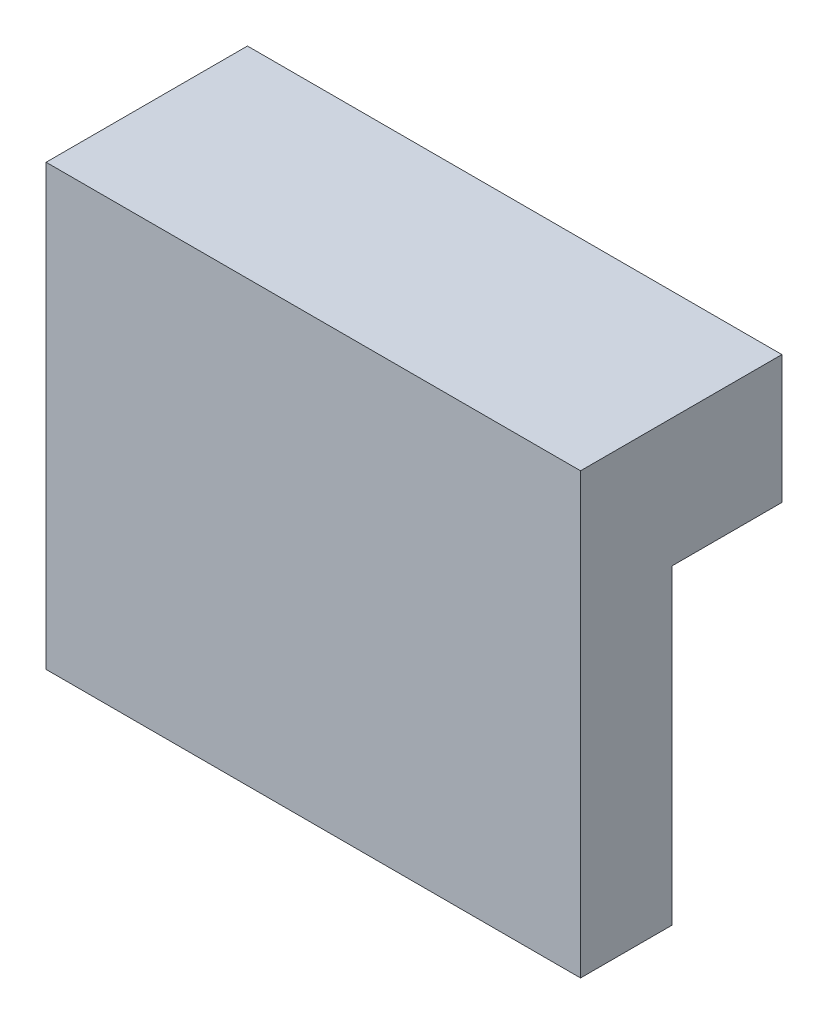
ISO-10303-21;
HEADER;
FILE_DESCRIPTION(('STEP AP214'),'2;1');
FILE_NAME('part.step','',(''),(''),'','','');
FILE_SCHEMA(('AUTOMOTIVE_DESIGN { 1 0 10303 214 1 1 1 1 }'));
ENDSEC;
DATA;
#1=APPLICATION_CONTEXT('core data for automotive mechanical design processes');
#2=APPLICATION_PROTOCOL_DEFINITION('international standard','automotive_design',2000,#1);
#3=PRODUCT_CONTEXT('',#1,'mechanical');
#4=PRODUCT('Part','Part','',(#3));
#5=PRODUCT_RELATED_PRODUCT_CATEGORY('part','',(#4));
#6=PRODUCT_DEFINITION_FORMATION('','',#4);
#7=PRODUCT_DEFINITION_CONTEXT('part definition',#1,'design');
#8=PRODUCT_DEFINITION('design','',#6,#7);
#9=PRODUCT_DEFINITION_SHAPE('','',#8);
#10=(LENGTH_UNIT() NAMED_UNIT(*) SI_UNIT(.MILLI.,.METRE.));
#11=(NAMED_UNIT(*) PLANE_ANGLE_UNIT() SI_UNIT($,.RADIAN.));
#12=(NAMED_UNIT(*) SI_UNIT($,.STERADIAN.) SOLID_ANGLE_UNIT());
#13=UNCERTAINTY_MEASURE_WITH_UNIT(LENGTH_MEASURE(1.E-05),#10,'distance_accuracy_value','');
#14=(GEOMETRIC_REPRESENTATION_CONTEXT(3) GLOBAL_UNCERTAINTY_ASSIGNED_CONTEXT((#13)) GLOBAL_UNIT_ASSIGNED_CONTEXT((#10,
#11,#12)) REPRESENTATION_CONTEXT('',''));
#15=CARTESIAN_POINT('',(0.,0.,0.));
#16=DIRECTION('',(0.,0.,1.));
#17=DIRECTION('',(1.,0.,0.));
#18=AXIS2_PLACEMENT_3D('',#15,#16,#17);
#19=CARTESIAN_POINT('',(0.,0.,-12.5));
#20=DIRECTION('',(0.,0.,1.));
#21=DIRECTION('',(1.,0.,0.));
#22=AXIS2_PLACEMENT_3D('',#19,#20,#21);
#23=PLANE('',#22);
#24=DIRECTION('',(-1.,0.,0.));
#25=VECTOR('',#24,1.);
#26=CARTESIAN_POINT('',(73.,25.,-12.5));
#27=LINE('',#26,#25);
#28=CARTESIAN_POINT('',(73.,25.,-12.5));
#29=VERTEX_POINT('',#28);
#30=CARTESIAN_POINT('',(-73.,25.,-12.5));
#31=VERTEX_POINT('',#30);
#32=EDGE_CURVE('E50',#29,#31,#27,.T.);
#33=ORIENTED_EDGE('',*,*,#32,.F.);
#34=DIRECTION('',(0.,1.,0.));
#35=VECTOR('',#34,1.);
#36=CARTESIAN_POINT('',(73.,60.,-12.5));
#37=LINE('',#36,#35);
#38=CARTESIAN_POINT('',(73.,-60.,-12.5));
#39=VERTEX_POINT('',#38);
#40=EDGE_CURVE('E118',#39,#29,#37,.T.);
#41=ORIENTED_EDGE('',*,*,#40,.F.);
#42=DIRECTION('',(1.,0.,0.));
#43=VECTOR('',#42,1.);
#44=CARTESIAN_POINT('',(-73.,-60.,-12.5));
#45=LINE('',#44,#43);
#46=CARTESIAN_POINT('',(-73.,-60.,-12.5));
#47=VERTEX_POINT('',#46);
#48=EDGE_CURVE('E74',#47,#39,#45,.T.);
#49=ORIENTED_EDGE('',*,*,#48,.F.);
#50=DIRECTION('',(0.,-1.,0.));
#51=VECTOR('',#50,1.);
#52=CARTESIAN_POINT('',(-73.,60.,-12.5));
#53=LINE('',#52,#51);
#54=EDGE_CURVE('E120',#31,#47,#53,.T.);
#55=ORIENTED_EDGE('',*,*,#54,.F.);
#56=EDGE_LOOP('',(#33,#41,#49,#55));
#57=FACE_BOUND('',#56,.T.);
#58=ADVANCED_FACE('F35',(#57),#23,.F.);
#59=CARTESIAN_POINT('',(73.,60.,12.5));
#60=DIRECTION('',(-1.,0.,0.));
#61=DIRECTION('',(0.,-1.,0.));
#62=AXIS2_PLACEMENT_3D('',#59,#60,#61);
#63=PLANE('',#62);
#64=ORIENTED_EDGE('',*,*,#40,.T.);
#65=DIRECTION('',(0.,0.,1.));
#66=VECTOR('',#65,1.);
#67=CARTESIAN_POINT('',(73.,25.,-42.5));
#68=LINE('',#67,#66);
#69=CARTESIAN_POINT('',(73.,25.,-42.5));
#70=VERTEX_POINT('',#69);
#71=EDGE_CURVE('E101',#70,#29,#68,.T.);
#72=ORIENTED_EDGE('',*,*,#71,.F.);
#73=DIRECTION('',(0.,-1.,0.));
#74=VECTOR('',#73,1.);
#75=CARTESIAN_POINT('',(73.,60.,-42.5));
#76=LINE('',#75,#74);
#77=CARTESIAN_POINT('',(73.,60.,-42.5));
#78=VERTEX_POINT('',#77);
#79=EDGE_CURVE('E108',#78,#70,#76,.T.);
#80=ORIENTED_EDGE('',*,*,#79,.F.);
#81=DIRECTION('',(0.,0.,-1.));
#82=VECTOR('',#81,1.);
#83=CARTESIAN_POINT('',(73.,60.,12.5));
#84=LINE('',#83,#82);
#85=CARTESIAN_POINT('',(73.,60.,12.5));
#86=VERTEX_POINT('',#85);
#87=EDGE_CURVE('E11',#86,#78,#84,.T.);
#88=ORIENTED_EDGE('',*,*,#87,.F.);
#89=DIRECTION('',(0.,1.,0.));
#90=VECTOR('',#89,1.);
#91=CARTESIAN_POINT('',(73.,60.,12.5));
#92=LINE('',#91,#90);
#93=CARTESIAN_POINT('',(73.,-60.,12.5));
#94=VERTEX_POINT('',#93);
#95=EDGE_CURVE('E125',#94,#86,#92,.T.);
#96=ORIENTED_EDGE('',*,*,#95,.F.);
#97=DIRECTION('',(0.,0.,-1.));
#98=VECTOR('',#97,1.);
#99=CARTESIAN_POINT('',(73.,-60.,12.5));
#100=LINE('',#99,#98);
#101=EDGE_CURVE('E130',#94,#39,#100,.T.);
#102=ORIENTED_EDGE('',*,*,#101,.T.);
#103=EDGE_LOOP('',(#64,#72,#80,#88,#96,#102));
#104=FACE_BOUND('',#103,.T.);
#105=ADVANCED_FACE('F37',(#104),#63,.F.);
#106=CARTESIAN_POINT('',(-73.,60.,12.5));
#107=DIRECTION('',(0.,-1.,0.));
#108=DIRECTION('',(0.,0.,-1.));
#109=AXIS2_PLACEMENT_3D('',#106,#107,#108);
#110=PLANE('',#109);
#111=ORIENTED_EDGE('',*,*,#87,.T.);
#112=DIRECTION('',(1.,0.,0.));
#113=VECTOR('',#112,1.);
#114=CARTESIAN_POINT('',(73.,60.,-42.5));
#115=LINE('',#114,#113);
#116=CARTESIAN_POINT('',(-73.,60.,-42.5));
#117=VERTEX_POINT('',#116);
#118=EDGE_CURVE('E114',#117,#78,#115,.T.);
#119=ORIENTED_EDGE('',*,*,#118,.F.);
#120=DIRECTION('',(0.,0.,-1.));
#121=VECTOR('',#120,1.);
#122=CARTESIAN_POINT('',(-73.,60.,12.5));
#123=LINE('',#122,#121);
#124=CARTESIAN_POINT('',(-73.,60.,12.5));
#125=VERTEX_POINT('',#124);
#126=EDGE_CURVE('E43',#125,#117,#123,.T.);
#127=ORIENTED_EDGE('',*,*,#126,.F.);
#128=DIRECTION('',(-1.,0.,0.));
#129=VECTOR('',#128,1.);
#130=CARTESIAN_POINT('',(-73.,60.,12.5));
#131=LINE('',#130,#129);
#132=EDGE_CURVE('E81',#86,#125,#131,.T.);
#133=ORIENTED_EDGE('',*,*,#132,.F.);
#134=EDGE_LOOP('',(#111,#119,#127,#133));
#135=FACE_BOUND('',#134,.T.);
#136=ADVANCED_FACE('F141',(#135),#110,.F.);
#137=CARTESIAN_POINT('',(-73.,60.,12.5));
#138=DIRECTION('',(1.,0.,0.));
#139=DIRECTION('',(0.,0.,-1.));
#140=AXIS2_PLACEMENT_3D('',#137,#138,#139);
#141=PLANE('',#140);
#142=ORIENTED_EDGE('',*,*,#126,.T.);
#143=DIRECTION('',(0.,1.,0.));
#144=VECTOR('',#143,1.);
#145=CARTESIAN_POINT('',(-73.,60.,-42.5));
#146=LINE('',#145,#144);
#147=CARTESIAN_POINT('',(-73.,25.,-42.5));
#148=VERTEX_POINT('',#147);
#149=EDGE_CURVE('E107',#148,#117,#146,.T.);
#150=ORIENTED_EDGE('',*,*,#149,.F.);
#151=DIRECTION('',(0.,0.,1.));
#152=VECTOR('',#151,1.);
#153=CARTESIAN_POINT('',(-73.,25.,-42.5));
#154=LINE('',#153,#152);
#155=EDGE_CURVE('E103',#148,#31,#154,.T.);
#156=ORIENTED_EDGE('',*,*,#155,.T.);
#157=ORIENTED_EDGE('',*,*,#54,.T.);
#158=DIRECTION('',(0.,0.,-1.));
#159=VECTOR('',#158,1.);
#160=CARTESIAN_POINT('',(-73.,-60.,12.5));
#161=LINE('',#160,#159);
#162=CARTESIAN_POINT('',(-73.,-60.,12.5));
#163=VERTEX_POINT('',#162);
#164=EDGE_CURVE('E135',#163,#47,#161,.T.);
#165=ORIENTED_EDGE('',*,*,#164,.F.);
#166=DIRECTION('',(0.,-1.,0.));
#167=VECTOR('',#166,1.);
#168=CARTESIAN_POINT('',(-73.,60.,12.5));
#169=LINE('',#168,#167);
#170=EDGE_CURVE('E128',#125,#163,#169,.T.);
#171=ORIENTED_EDGE('',*,*,#170,.F.);
#172=EDGE_LOOP('',(#142,#150,#156,#157,#165,#171));
#173=FACE_BOUND('',#172,.T.);
#174=ADVANCED_FACE('F138',(#173),#141,.F.);
#175=CARTESIAN_POINT('',(-73.,-60.,12.5));
#176=DIRECTION('',(0.,1.,0.));
#177=DIRECTION('',(0.,0.,1.));
#178=AXIS2_PLACEMENT_3D('',#175,#176,#177);
#179=PLANE('',#178);
#180=ORIENTED_EDGE('',*,*,#48,.T.);
#181=ORIENTED_EDGE('',*,*,#101,.F.);
#182=DIRECTION('',(1.,0.,0.));
#183=VECTOR('',#182,1.);
#184=CARTESIAN_POINT('',(-73.,-60.,12.5));
#185=LINE('',#184,#183);
#186=EDGE_CURVE('E59',#163,#94,#185,.T.);
#187=ORIENTED_EDGE('',*,*,#186,.F.);
#188=ORIENTED_EDGE('',*,*,#164,.T.);
#189=EDGE_LOOP('',(#180,#181,#187,#188));
#190=FACE_BOUND('',#189,.T.);
#191=ADVANCED_FACE('F143',(#190),#179,.F.);
#192=CARTESIAN_POINT('',(0.,0.,12.5));
#193=DIRECTION('',(0.,0.,1.));
#194=DIRECTION('',(1.,0.,0.));
#195=AXIS2_PLACEMENT_3D('',#192,#193,#194);
#196=PLANE('',#195);
#197=ORIENTED_EDGE('',*,*,#95,.T.);
#198=ORIENTED_EDGE('',*,*,#132,.T.);
#199=ORIENTED_EDGE('',*,*,#170,.T.);
#200=ORIENTED_EDGE('',*,*,#186,.T.);
#201=EDGE_LOOP('',(#197,#198,#199,#200));
#202=FACE_BOUND('',#201,.T.);
#203=ADVANCED_FACE('F151',(#202),#196,.T.);
#204=CARTESIAN_POINT('',(73.,25.,-42.5));
#205=DIRECTION('',(0.,1.,0.));
#206=DIRECTION('',(0.,0.,1.));
#207=AXIS2_PLACEMENT_3D('',#204,#205,#206);
#208=PLANE('',#207);
#209=ORIENTED_EDGE('',*,*,#32,.T.);
#210=ORIENTED_EDGE('',*,*,#155,.F.);
#211=DIRECTION('',(-1.,0.,0.));
#212=VECTOR('',#211,1.);
#213=CARTESIAN_POINT('',(73.,25.,-42.5));
#214=LINE('',#213,#212);
#215=EDGE_CURVE('E97',#70,#148,#214,.T.);
#216=ORIENTED_EDGE('',*,*,#215,.F.);
#217=ORIENTED_EDGE('',*,*,#71,.T.);
#218=EDGE_LOOP('',(#209,#210,#216,#217));
#219=FACE_BOUND('',#218,.T.);
#220=ADVANCED_FACE('F99',(#219),#208,.F.);
#221=CARTESIAN_POINT('',(0.,0.,-42.5));
#222=DIRECTION('',(0.,0.,-1.));
#223=DIRECTION('',(-1.,0.,0.));
#224=AXIS2_PLACEMENT_3D('',#221,#222,#223);
#225=PLANE('',#224);
#226=ORIENTED_EDGE('',*,*,#79,.T.);
#227=ORIENTED_EDGE('',*,*,#215,.T.);
#228=ORIENTED_EDGE('',*,*,#149,.T.);
#229=ORIENTED_EDGE('',*,*,#118,.T.);
#230=EDGE_LOOP('',(#226,#227,#228,#229));
#231=FACE_BOUND('',#230,.T.);
#232=ADVANCED_FACE('F112',(#231),#225,.T.);
#233=CLOSED_SHELL('',(#58,#105,#136,#174,#191,#203,#220,#232));
#234=MANIFOLD_SOLID_BREP('B2',#233);
#235=ADVANCED_BREP_SHAPE_REPRESENTATION('',(#18,#234),#14);
#236=SHAPE_DEFINITION_REPRESENTATION(#9,#235);
ENDSEC;
END-ISO-10303-21;
